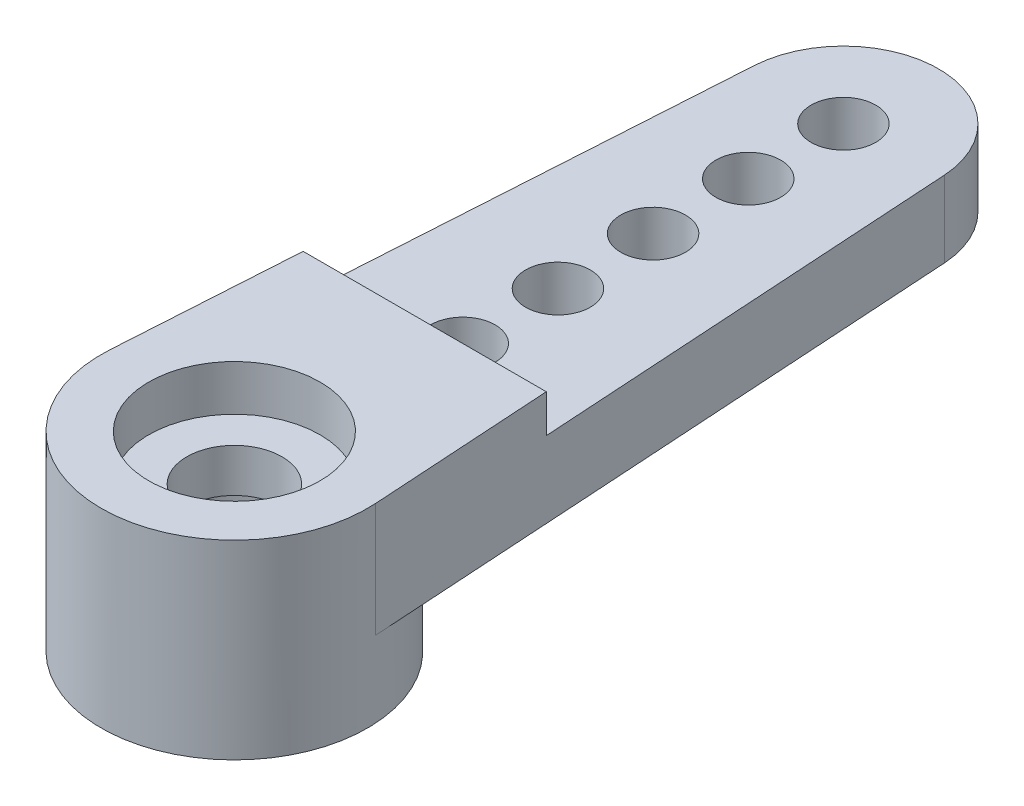
ISO-10303-21;
HEADER;
FILE_DESCRIPTION(('STEP AP214'),'2;1');
FILE_NAME('part.step','',(''),(''),'','','');
FILE_SCHEMA(('AUTOMOTIVE_DESIGN { 1 0 10303 214 1 1 1 1 }'));
ENDSEC;
DATA;
#1=APPLICATION_CONTEXT('core data for automotive mechanical design processes');
#2=APPLICATION_PROTOCOL_DEFINITION('international standard','automotive_design',2000,#1);
#3=PRODUCT_CONTEXT('',#1,'mechanical');
#4=PRODUCT('Part','Part','',(#3));
#5=PRODUCT_RELATED_PRODUCT_CATEGORY('part','',(#4));
#6=PRODUCT_DEFINITION_FORMATION('','',#4);
#7=PRODUCT_DEFINITION_CONTEXT('part definition',#1,'design');
#8=PRODUCT_DEFINITION('design','',#6,#7);
#9=PRODUCT_DEFINITION_SHAPE('','',#8);
#10=(LENGTH_UNIT() NAMED_UNIT(*) SI_UNIT(.MILLI.,.METRE.));
#11=(NAMED_UNIT(*) PLANE_ANGLE_UNIT() SI_UNIT($,.RADIAN.));
#12=(NAMED_UNIT(*) SI_UNIT($,.STERADIAN.) SOLID_ANGLE_UNIT());
#13=UNCERTAINTY_MEASURE_WITH_UNIT(LENGTH_MEASURE(1.E-05),#10,'distance_accuracy_value','');
#14=(GEOMETRIC_REPRESENTATION_CONTEXT(3) GLOBAL_UNCERTAINTY_ASSIGNED_CONTEXT((#13)) GLOBAL_UNIT_ASSIGNED_CONTEXT((#10,
#11,#12)) REPRESENTATION_CONTEXT('',''));
#15=CARTESIAN_POINT('',(0.,0.,0.));
#16=DIRECTION('',(0.,0.,1.));
#17=DIRECTION('',(1.,0.,0.));
#18=AXIS2_PLACEMENT_3D('',#15,#16,#17);
#19=CARTESIAN_POINT('',(0.,0.,0.));
#20=DIRECTION('',(0.,-1.,0.));
#21=DIRECTION('',(0.,0.,-1.));
#22=AXIS2_PLACEMENT_3D('',#19,#20,#21);
#23=CYLINDRICAL_SURFACE('',#22,3.5);
#24=CARTESIAN_POINT('',(0.,5.,0.));
#25=DIRECTION('',(0.,-1.,0.));
#26=DIRECTION('',(0.,0.,-1.));
#27=AXIS2_PLACEMENT_3D('',#24,#25,#26);
#28=CIRCLE('',#27,3.5);
#29=CARTESIAN_POINT('',(3.49315737370935,5.,-0.21875));
#30=VERTEX_POINT('',#29);
#31=CARTESIAN_POINT('',(-3.49315737370935,5.,-0.218749999999999));
#32=VERTEX_POINT('',#31);
#33=EDGE_CURVE('E119',#30,#32,#28,.T.);
#34=ORIENTED_EDGE('',*,*,#33,.T.);
#35=DIRECTION('',(0.,-1.,0.));
#36=VECTOR('',#35,1.);
#37=CARTESIAN_POINT('',(-3.49315737370935,4.,-0.218749999999998));
#38=LINE('',#37,#36);
#39=CARTESIAN_POINT('',(-3.49315737370935,2.,-0.218749999999998));
#40=VERTEX_POINT('',#39);
#41=EDGE_CURVE('E84',#32,#40,#38,.T.);
#42=ORIENTED_EDGE('',*,*,#41,.T.);
#43=CARTESIAN_POINT('',(0.,2.,0.));
#44=DIRECTION('',(0.,1.,0.));
#45=DIRECTION('',(0.,0.,-1.));
#46=AXIS2_PLACEMENT_3D('',#43,#44,#45);
#47=CIRCLE('',#46,3.5);
#48=CARTESIAN_POINT('',(3.49315737370935,2.,-0.21875));
#49=VERTEX_POINT('',#48);
#50=EDGE_CURVE('E93',#49,#40,#47,.T.);
#51=ORIENTED_EDGE('',*,*,#50,.F.);
#52=DIRECTION('',(0.,-1.,0.));
#53=VECTOR('',#52,1.);
#54=CARTESIAN_POINT('',(3.49315737370935,4.,-0.21875));
#55=LINE('',#54,#53);
#56=EDGE_CURVE('E102',#30,#49,#55,.T.);
#57=ORIENTED_EDGE('',*,*,#56,.F.);
#58=EDGE_LOOP('',(#34,#42,#51,#57));
#59=FACE_BOUND('',#58,.T.);
#60=CARTESIAN_POINT('',(0.,0.,0.));
#61=DIRECTION('',(0.,-1.,0.));
#62=DIRECTION('',(0.,0.,-1.));
#63=AXIS2_PLACEMENT_3D('',#60,#61,#62);
#64=CIRCLE('',#63,3.5);
#65=CARTESIAN_POINT('',(0.,0.,-3.5));
#66=VERTEX_POINT('',#65);
#67=EDGE_CURVE('E44',#66,#66,#64,.T.);
#68=ORIENTED_EDGE('',*,*,#67,.F.);
#69=EDGE_LOOP('',(#68));
#70=FACE_BOUND('',#69,.T.);
#71=ADVANCED_FACE('F36',(#59,#70),#23,.T.);
#72=CARTESIAN_POINT('',(0.,0.,0.));
#73=DIRECTION('',(0.,-1.,0.));
#74=DIRECTION('',(0.,0.,-1.));
#75=AXIS2_PLACEMENT_3D('',#72,#73,#74);
#76=CYLINDRICAL_SURFACE('',#75,2.4);
#77=CARTESIAN_POINT('',(0.,2.66,0.));
#78=DIRECTION('',(0.,-1.,0.));
#79=DIRECTION('',(0.,0.,-1.));
#80=AXIS2_PLACEMENT_3D('',#77,#78,#79);
#81=CIRCLE('',#80,2.4);
#82=CARTESIAN_POINT('',(0.,2.66,-2.4));
#83=VERTEX_POINT('',#82);
#84=EDGE_CURVE('E83',#83,#83,#81,.T.);
#85=ORIENTED_EDGE('',*,*,#84,.F.);
#86=EDGE_LOOP('',(#85));
#87=FACE_BOUND('',#86,.T.);
#88=CARTESIAN_POINT('',(0.,0.,0.));
#89=DIRECTION('',(0.,-1.,0.));
#90=DIRECTION('',(0.,0.,-1.));
#91=AXIS2_PLACEMENT_3D('',#88,#89,#90);
#92=CIRCLE('',#91,2.4);
#93=CARTESIAN_POINT('',(0.,0.,-2.4));
#94=VERTEX_POINT('',#93);
#95=EDGE_CURVE('E11',#94,#94,#92,.T.);
#96=ORIENTED_EDGE('',*,*,#95,.T.);
#97=EDGE_LOOP('',(#96));
#98=FACE_BOUND('',#97,.T.);
#99=ADVANCED_FACE('F38',(#87,#98),#76,.F.);
#100=CARTESIAN_POINT('',(-2.4,0.,0.));
#101=DIRECTION('',(0.,1.,0.));
#102=DIRECTION('',(0.,0.,1.));
#103=AXIS2_PLACEMENT_3D('',#100,#101,#102);
#104=PLANE('',#103);
#105=ORIENTED_EDGE('',*,*,#95,.F.);
#106=EDGE_LOOP('',(#105));
#107=FACE_BOUND('',#106,.T.);
#108=ORIENTED_EDGE('',*,*,#67,.T.);
#109=EDGE_LOOP('',(#108));
#110=FACE_BOUND('',#109,.T.);
#111=ADVANCED_FACE('F124',(#107,#110),#104,.F.);
#112=CARTESIAN_POINT('',(-3.5,5.,0.));
#113=DIRECTION('',(0.,-1.,0.));
#114=DIRECTION('',(0.,0.,-1.));
#115=AXIS2_PLACEMENT_3D('',#112,#113,#114);
#116=PLANE('',#115);
#117=ORIENTED_EDGE('',*,*,#33,.F.);
#118=DIRECTION('',(-0.0624999999999998,0.,-0.998044963916957));
#119=VECTOR('',#118,1.);
#120=CARTESIAN_POINT('',(3.19374388453426,5.,-5.));
#121=LINE('',#120,#119);
#122=CARTESIAN_POINT('',(3.19374388453426,5.,-5.));
#123=VERTEX_POINT('',#122);
#124=EDGE_CURVE('E228',#30,#123,#121,.T.);
#125=ORIENTED_EDGE('',*,*,#124,.T.);
#126=DIRECTION('',(-1.,0.,0.));
#127=VECTOR('',#126,1.);
#128=CARTESIAN_POINT('',(-3.19374388453426,5.,-5.));
#129=LINE('',#128,#127);
#130=CARTESIAN_POINT('',(-3.19374388453426,5.,-5.));
#131=VERTEX_POINT('',#130);
#132=EDGE_CURVE('E238',#123,#131,#129,.T.);
#133=ORIENTED_EDGE('',*,*,#132,.T.);
#134=DIRECTION('',(-0.0624999999999999,0.,0.998044963916957));
#135=VECTOR('',#134,1.);
#136=CARTESIAN_POINT('',(-3.49315737370935,5.,-0.218749999999998));
#137=LINE('',#136,#135);
#138=EDGE_CURVE('E225',#131,#32,#137,.T.);
#139=ORIENTED_EDGE('',*,*,#138,.T.);
#140=EDGE_LOOP('',(#117,#125,#133,#139));
#141=FACE_BOUND('',#140,.T.);
#142=CARTESIAN_POINT('',(0.,5.,0.));
#143=DIRECTION('',(0.,-1.,0.));
#144=DIRECTION('',(0.,0.,-1.));
#145=AXIS2_PLACEMENT_3D('',#142,#143,#144);
#146=CIRCLE('',#145,2.25);
#147=CARTESIAN_POINT('',(0.,5.,-2.25));
#148=VERTEX_POINT('',#147);
#149=EDGE_CURVE('E116',#148,#148,#146,.T.);
#150=ORIENTED_EDGE('',*,*,#149,.T.);
#151=EDGE_LOOP('',(#150));
#152=FACE_BOUND('',#151,.T.);
#153=ADVANCED_FACE('F134',(#141,#152),#116,.F.);
#154=CARTESIAN_POINT('',(0.,0.,0.));
#155=DIRECTION('',(0.,-1.,0.));
#156=DIRECTION('',(0.,0.,-1.));
#157=AXIS2_PLACEMENT_3D('',#154,#155,#156);
#158=CYLINDRICAL_SURFACE('',#157,2.25);
#159=ORIENTED_EDGE('',*,*,#149,.F.);
#160=EDGE_LOOP('',(#159));
#161=FACE_BOUND('',#160,.T.);
#162=CARTESIAN_POINT('',(0.,3.8,0.));
#163=DIRECTION('',(0.,-1.,0.));
#164=DIRECTION('',(0.,0.,-1.));
#165=AXIS2_PLACEMENT_3D('',#162,#163,#164);
#166=CIRCLE('',#165,2.25);
#167=CARTESIAN_POINT('',(0.,3.8,-2.25));
#168=VERTEX_POINT('',#167);
#169=EDGE_CURVE('E113',#168,#168,#166,.T.);
#170=ORIENTED_EDGE('',*,*,#169,.T.);
#171=EDGE_LOOP('',(#170));
#172=FACE_BOUND('',#171,.T.);
#173=ADVANCED_FACE('F141',(#161,#172),#158,.F.);
#174=CARTESIAN_POINT('',(-2.25,3.8,0.));
#175=DIRECTION('',(0.,-1.,0.));
#176=DIRECTION('',(0.,0.,-1.));
#177=AXIS2_PLACEMENT_3D('',#174,#175,#176);
#178=PLANE('',#177);
#179=ORIENTED_EDGE('',*,*,#169,.F.);
#180=EDGE_LOOP('',(#179));
#181=FACE_BOUND('',#180,.T.);
#182=CARTESIAN_POINT('',(0.,3.8,0.));
#183=DIRECTION('',(0.,-1.,0.));
#184=DIRECTION('',(0.,0.,-1.));
#185=AXIS2_PLACEMENT_3D('',#182,#183,#184);
#186=CIRCLE('',#185,1.25);
#187=CARTESIAN_POINT('',(0.,3.8,-1.25));
#188=VERTEX_POINT('',#187);
#189=EDGE_CURVE('E110',#188,#188,#186,.T.);
#190=ORIENTED_EDGE('',*,*,#189,.T.);
#191=EDGE_LOOP('',(#190));
#192=FACE_BOUND('',#191,.T.);
#193=ADVANCED_FACE('F148',(#181,#192),#178,.F.);
#194=CARTESIAN_POINT('',(0.,0.,0.));
#195=DIRECTION('',(0.,-1.,0.));
#196=DIRECTION('',(0.,0.,-1.));
#197=AXIS2_PLACEMENT_3D('',#194,#195,#196);
#198=CYLINDRICAL_SURFACE('',#197,1.25);
#199=ORIENTED_EDGE('',*,*,#189,.F.);
#200=EDGE_LOOP('',(#199));
#201=FACE_BOUND('',#200,.T.);
#202=CARTESIAN_POINT('',(0.,2.66,0.));
#203=DIRECTION('',(0.,-1.,0.));
#204=DIRECTION('',(0.,0.,-1.));
#205=AXIS2_PLACEMENT_3D('',#202,#203,#204);
#206=CIRCLE('',#205,1.25);
#207=CARTESIAN_POINT('',(0.,2.66,-1.25));
#208=VERTEX_POINT('',#207);
#209=EDGE_CURVE('E107',#208,#208,#206,.T.);
#210=ORIENTED_EDGE('',*,*,#209,.T.);
#211=EDGE_LOOP('',(#210));
#212=FACE_BOUND('',#211,.T.);
#213=ADVANCED_FACE('F161',(#201,#212),#198,.F.);
#214=CARTESIAN_POINT('',(-1.25,2.66,0.));
#215=DIRECTION('',(0.,1.,0.));
#216=DIRECTION('',(0.,0.,1.));
#217=AXIS2_PLACEMENT_3D('',#214,#215,#216);
#218=PLANE('',#217);
#219=ORIENTED_EDGE('',*,*,#209,.F.);
#220=EDGE_LOOP('',(#219));
#221=FACE_BOUND('',#220,.T.);
#222=ORIENTED_EDGE('',*,*,#84,.T.);
#223=EDGE_LOOP('',(#222));
#224=FACE_BOUND('',#223,.T.);
#225=ADVANCED_FACE('F167',(#221,#224),#218,.F.);
#226=CARTESIAN_POINT('',(0.,4.,-16.));
#227=DIRECTION('',(0.,-1.,0.));
#228=DIRECTION('',(0.,0.,-1.));
#229=AXIS2_PLACEMENT_3D('',#226,#227,#228);
#230=CYLINDRICAL_SURFACE('',#229,2.5);
#231=CARTESIAN_POINT('',(0.,2.,-16.));
#232=DIRECTION('',(0.,-1.,0.));
#233=DIRECTION('',(0.,0.,-1.));
#234=AXIS2_PLACEMENT_3D('',#231,#232,#233);
#235=CIRCLE('',#234,2.5);
#236=CARTESIAN_POINT('',(-2.49511240979239,2.,-16.15625));
#237=VERTEX_POINT('',#236);
#238=CARTESIAN_POINT('',(2.49511240979239,2.,-16.15625));
#239=VERTEX_POINT('',#238);
#240=EDGE_CURVE('E86',#237,#239,#235,.T.);
#241=ORIENTED_EDGE('',*,*,#240,.F.);
#242=DIRECTION('',(0.,-1.,0.));
#243=VECTOR('',#242,1.);
#244=CARTESIAN_POINT('',(-2.49511240979239,4.,-16.15625));
#245=LINE('',#244,#243);
#246=CARTESIAN_POINT('',(-2.49511240979239,4.,-16.15625));
#247=VERTEX_POINT('',#246);
#248=EDGE_CURVE('E73',#247,#237,#245,.T.);
#249=ORIENTED_EDGE('',*,*,#248,.F.);
#250=CARTESIAN_POINT('',(0.,4.,-16.));
#251=DIRECTION('',(0.,-1.,0.));
#252=DIRECTION('',(0.,0.,-1.));
#253=AXIS2_PLACEMENT_3D('',#250,#251,#252);
#254=CIRCLE('',#253,2.5);
#255=CARTESIAN_POINT('',(2.49511240979239,4.,-16.15625));
#256=VERTEX_POINT('',#255);
#257=EDGE_CURVE('E94',#247,#256,#254,.T.);
#258=ORIENTED_EDGE('',*,*,#257,.T.);
#259=DIRECTION('',(0.,-1.,0.));
#260=VECTOR('',#259,1.);
#261=CARTESIAN_POINT('',(2.49511240979239,4.,-16.15625));
#262=LINE('',#261,#260);
#263=EDGE_CURVE('E88',#256,#239,#262,.T.);
#264=ORIENTED_EDGE('',*,*,#263,.T.);
#265=EDGE_LOOP('',(#241,#249,#258,#264));
#266=FACE_BOUND('',#265,.T.);
#267=ADVANCED_FACE('F87',(#266),#230,.T.);
#268=CARTESIAN_POINT('',(-2.49511240979239,4.,-16.15625));
#269=DIRECTION('',(-0.998044963916957,0.,-0.0625));
#270=DIRECTION('',(-0.0625,0.,0.998044963916957));
#271=AXIS2_PLACEMENT_3D('',#268,#269,#270);
#272=PLANE('',#271);
#273=DIRECTION('',(0.0625,0.,-0.998044963916957));
#274=VECTOR('',#273,1.);
#275=CARTESIAN_POINT('',(-2.49511240979239,2.,-16.15625));
#276=LINE('',#275,#274);
#277=EDGE_CURVE('E78',#40,#237,#276,.T.);
#278=ORIENTED_EDGE('',*,*,#277,.F.);
#279=ORIENTED_EDGE('',*,*,#41,.F.);
#280=ORIENTED_EDGE('',*,*,#138,.F.);
#281=DIRECTION('',(0.,1.,0.));
#282=VECTOR('',#281,1.);
#283=CARTESIAN_POINT('',(-3.19374388453426,4.,-5.));
#284=LINE('',#283,#282);
#285=CARTESIAN_POINT('',(-3.19374388453426,4.,-5.));
#286=VERTEX_POINT('',#285);
#287=EDGE_CURVE('E89',#286,#131,#284,.T.);
#288=ORIENTED_EDGE('',*,*,#287,.F.);
#289=DIRECTION('',(0.0625,0.,-0.998044963916957));
#290=VECTOR('',#289,1.);
#291=CARTESIAN_POINT('',(-2.49511240979239,4.,-16.15625));
#292=LINE('',#291,#290);
#293=EDGE_CURVE('E60',#286,#247,#292,.T.);
#294=ORIENTED_EDGE('',*,*,#293,.T.);
#295=ORIENTED_EDGE('',*,*,#248,.T.);
#296=EDGE_LOOP('',(#278,#279,#280,#288,#294,#295));
#297=FACE_BOUND('',#296,.T.);
#298=ADVANCED_FACE('F75',(#297),#272,.T.);
#299=CARTESIAN_POINT('',(2.49511240979239,4.,-16.15625));
#300=DIRECTION('',(0.998044963916957,0.,-0.0624999999999999));
#301=DIRECTION('',(-0.0625,0.,-0.998044963916957));
#302=AXIS2_PLACEMENT_3D('',#299,#300,#301);
#303=PLANE('',#302);
#304=DIRECTION('',(0.0624999999999999,0.,0.998044963916957));
#305=VECTOR('',#304,1.);
#306=CARTESIAN_POINT('',(2.49511240979239,2.,-16.15625));
#307=LINE('',#306,#305);
#308=EDGE_CURVE('E51',#239,#49,#307,.T.);
#309=ORIENTED_EDGE('',*,*,#308,.F.);
#310=ORIENTED_EDGE('',*,*,#263,.F.);
#311=DIRECTION('',(0.0624999999999999,0.,0.998044963916957));
#312=VECTOR('',#311,1.);
#313=CARTESIAN_POINT('',(2.49511240979239,4.,-16.15625));
#314=LINE('',#313,#312);
#315=CARTESIAN_POINT('',(3.19374388453426,4.,-5.));
#316=VERTEX_POINT('',#315);
#317=EDGE_CURVE('E96',#256,#316,#314,.T.);
#318=ORIENTED_EDGE('',*,*,#317,.T.);
#319=DIRECTION('',(0.,1.,0.));
#320=VECTOR('',#319,1.);
#321=CARTESIAN_POINT('',(3.19374388453426,4.,-5.));
#322=LINE('',#321,#320);
#323=EDGE_CURVE('E237',#316,#123,#322,.T.);
#324=ORIENTED_EDGE('',*,*,#323,.T.);
#325=ORIENTED_EDGE('',*,*,#124,.F.);
#326=ORIENTED_EDGE('',*,*,#56,.T.);
#327=EDGE_LOOP('',(#309,#310,#318,#324,#325,#326));
#328=FACE_BOUND('',#327,.T.);
#329=ADVANCED_FACE('F180',(#328),#303,.T.);
#330=CARTESIAN_POINT('',(0.,4.,-16.));
#331=DIRECTION('',(0.,-1.,0.));
#332=DIRECTION('',(0.,0.,-1.));
#333=AXIS2_PLACEMENT_3D('',#330,#331,#332);
#334=PLANE('',#333);
#335=CARTESIAN_POINT('',(0.,4.,-6.));
#336=DIRECTION('',(0.,-1.,0.));
#337=DIRECTION('',(0.,0.,-1.));
#338=AXIS2_PLACEMENT_3D('',#335,#336,#337);
#339=CIRCLE('',#338,0.85);
#340=CARTESIAN_POINT('',(0.,4.,-6.85));
#341=VERTEX_POINT('',#340);
#342=EDGE_CURVE('E224',#341,#341,#339,.T.);
#343=ORIENTED_EDGE('',*,*,#342,.T.);
#344=EDGE_LOOP('',(#343));
#345=FACE_BOUND('',#344,.T.);
#346=CARTESIAN_POINT('',(0.,4.,-16.));
#347=DIRECTION('',(0.,-1.,0.));
#348=DIRECTION('',(0.,0.,-1.));
#349=AXIS2_PLACEMENT_3D('',#346,#347,#348);
#350=CIRCLE('',#349,0.85);
#351=CARTESIAN_POINT('',(0.,4.,-16.85));
#352=VERTEX_POINT('',#351);
#353=EDGE_CURVE('E226',#352,#352,#350,.T.);
#354=ORIENTED_EDGE('',*,*,#353,.T.);
#355=EDGE_LOOP('',(#354));
#356=FACE_BOUND('',#355,.T.);
#357=CARTESIAN_POINT('',(0.,4.,-13.5));
#358=DIRECTION('',(0.,-1.,0.));
#359=DIRECTION('',(0.,0.,-1.));
#360=AXIS2_PLACEMENT_3D('',#357,#358,#359);
#361=CIRCLE('',#360,0.85);
#362=CARTESIAN_POINT('',(0.,4.,-14.35));
#363=VERTEX_POINT('',#362);
#364=EDGE_CURVE('E231',#363,#363,#361,.T.);
#365=ORIENTED_EDGE('',*,*,#364,.T.);
#366=EDGE_LOOP('',(#365));
#367=FACE_BOUND('',#366,.T.);
#368=CARTESIAN_POINT('',(0.,4.,-8.5));
#369=DIRECTION('',(0.,-1.,0.));
#370=DIRECTION('',(0.,0.,-1.));
#371=AXIS2_PLACEMENT_3D('',#368,#369,#370);
#372=CIRCLE('',#371,0.85);
#373=CARTESIAN_POINT('',(0.,4.,-9.35));
#374=VERTEX_POINT('',#373);
#375=EDGE_CURVE('E268',#374,#374,#372,.T.);
#376=ORIENTED_EDGE('',*,*,#375,.T.);
#377=EDGE_LOOP('',(#376));
#378=FACE_BOUND('',#377,.T.);
#379=CARTESIAN_POINT('',(0.,4.,-11.));
#380=DIRECTION('',(0.,-1.,0.));
#381=DIRECTION('',(0.,0.,-1.));
#382=AXIS2_PLACEMENT_3D('',#379,#380,#381);
#383=CIRCLE('',#382,0.85);
#384=CARTESIAN_POINT('',(0.,4.,-11.85));
#385=VERTEX_POINT('',#384);
#386=EDGE_CURVE('E271',#385,#385,#383,.T.);
#387=ORIENTED_EDGE('',*,*,#386,.T.);
#388=EDGE_LOOP('',(#387));
#389=FACE_BOUND('',#388,.T.);
#390=ORIENTED_EDGE('',*,*,#293,.F.);
#391=DIRECTION('',(-1.,0.,0.));
#392=VECTOR('',#391,1.);
#393=CARTESIAN_POINT('',(-3.19374388453426,4.,-5.));
#394=LINE('',#393,#392);
#395=EDGE_CURVE('E235',#316,#286,#394,.T.);
#396=ORIENTED_EDGE('',*,*,#395,.F.);
#397=ORIENTED_EDGE('',*,*,#317,.F.);
#398=ORIENTED_EDGE('',*,*,#257,.F.);
#399=EDGE_LOOP('',(#390,#396,#397,#398));
#400=FACE_BOUND('',#399,.T.);
#401=ADVANCED_FACE('F183',(#345,#356,#367,#378,#389,#400),#334,.F.);
#402=CARTESIAN_POINT('',(0.,2.,-16.));
#403=DIRECTION('',(0.,-1.,0.));
#404=DIRECTION('',(0.,0.,-1.));
#405=AXIS2_PLACEMENT_3D('',#402,#403,#404);
#406=PLANE('',#405);
#407=CARTESIAN_POINT('',(0.,2.,-6.));
#408=DIRECTION('',(0.,-1.,0.));
#409=DIRECTION('',(0.,0.,-1.));
#410=AXIS2_PLACEMENT_3D('',#407,#408,#409);
#411=CIRCLE('',#410,0.85);
#412=CARTESIAN_POINT('',(0.,2.,-6.85));
#413=VERTEX_POINT('',#412);
#414=EDGE_CURVE('E221',#413,#413,#411,.T.);
#415=ORIENTED_EDGE('',*,*,#414,.F.);
#416=EDGE_LOOP('',(#415));
#417=FACE_BOUND('',#416,.T.);
#418=CARTESIAN_POINT('',(0.,2.,-16.));
#419=DIRECTION('',(0.,-1.,0.));
#420=DIRECTION('',(0.,0.,-1.));
#421=AXIS2_PLACEMENT_3D('',#418,#419,#420);
#422=CIRCLE('',#421,0.85);
#423=CARTESIAN_POINT('',(0.,2.,-16.85));
#424=VERTEX_POINT('',#423);
#425=EDGE_CURVE('E283',#424,#424,#422,.T.);
#426=ORIENTED_EDGE('',*,*,#425,.F.);
#427=EDGE_LOOP('',(#426));
#428=FACE_BOUND('',#427,.T.);
#429=CARTESIAN_POINT('',(0.,2.,-13.5));
#430=DIRECTION('',(0.,-1.,0.));
#431=DIRECTION('',(0.,0.,-1.));
#432=AXIS2_PLACEMENT_3D('',#429,#430,#431);
#433=CIRCLE('',#432,0.85);
#434=CARTESIAN_POINT('',(0.,2.,-14.35));
#435=VERTEX_POINT('',#434);
#436=EDGE_CURVE('E280',#435,#435,#433,.T.);
#437=ORIENTED_EDGE('',*,*,#436,.F.);
#438=EDGE_LOOP('',(#437));
#439=FACE_BOUND('',#438,.T.);
#440=CARTESIAN_POINT('',(0.,2.,-8.5));
#441=DIRECTION('',(0.,-1.,0.));
#442=DIRECTION('',(0.,0.,-1.));
#443=AXIS2_PLACEMENT_3D('',#440,#441,#442);
#444=CIRCLE('',#443,0.85);
#445=CARTESIAN_POINT('',(0.,2.,-9.35));
#446=VERTEX_POINT('',#445);
#447=EDGE_CURVE('E277',#446,#446,#444,.T.);
#448=ORIENTED_EDGE('',*,*,#447,.F.);
#449=EDGE_LOOP('',(#448));
#450=FACE_BOUND('',#449,.T.);
#451=CARTESIAN_POINT('',(0.,2.,-11.));
#452=DIRECTION('',(0.,-1.,0.));
#453=DIRECTION('',(0.,0.,-1.));
#454=AXIS2_PLACEMENT_3D('',#451,#452,#453);
#455=CIRCLE('',#454,0.85);
#456=CARTESIAN_POINT('',(0.,2.,-11.85));
#457=VERTEX_POINT('',#456);
#458=EDGE_CURVE('E274',#457,#457,#455,.T.);
#459=ORIENTED_EDGE('',*,*,#458,.F.);
#460=EDGE_LOOP('',(#459));
#461=FACE_BOUND('',#460,.T.);
#462=ORIENTED_EDGE('',*,*,#240,.T.);
#463=ORIENTED_EDGE('',*,*,#308,.T.);
#464=ORIENTED_EDGE('',*,*,#50,.T.);
#465=ORIENTED_EDGE('',*,*,#277,.T.);
#466=EDGE_LOOP('',(#462,#463,#464,#465));
#467=FACE_BOUND('',#466,.T.);
#468=ADVANCED_FACE('F91',(#417,#428,#439,#450,#461,#467),#406,.T.);
#469=CARTESIAN_POINT('',(-3.19374388453426,4.,-5.));
#470=DIRECTION('',(0.,0.,-1.));
#471=DIRECTION('',(-1.,0.,0.));
#472=AXIS2_PLACEMENT_3D('',#469,#470,#471);
#473=PLANE('',#472);
#474=ORIENTED_EDGE('',*,*,#132,.F.);
#475=ORIENTED_EDGE('',*,*,#323,.F.);
#476=ORIENTED_EDGE('',*,*,#395,.T.);
#477=ORIENTED_EDGE('',*,*,#287,.T.);
#478=EDGE_LOOP('',(#474,#475,#476,#477));
#479=FACE_BOUND('',#478,.T.);
#480=ADVANCED_FACE('F189',(#479),#473,.T.);
#481=CARTESIAN_POINT('',(0.,12.,-11.));
#482=DIRECTION('',(0.,-1.,0.));
#483=DIRECTION('',(0.,0.,-1.));
#484=AXIS2_PLACEMENT_3D('',#481,#482,#483);
#485=CYLINDRICAL_SURFACE('',#484,0.85);
#486=ORIENTED_EDGE('',*,*,#458,.T.);
#487=EDGE_LOOP('',(#486));
#488=FACE_BOUND('',#487,.T.);
#489=ORIENTED_EDGE('',*,*,#386,.F.);
#490=EDGE_LOOP('',(#489));
#491=FACE_BOUND('',#490,.T.);
#492=ADVANCED_FACE('F196',(#488,#491),#485,.F.);
#493=CARTESIAN_POINT('',(0.,12.,-8.5));
#494=DIRECTION('',(0.,-1.,0.));
#495=DIRECTION('',(0.,0.,-1.));
#496=AXIS2_PLACEMENT_3D('',#493,#494,#495);
#497=CYLINDRICAL_SURFACE('',#496,0.85);
#498=ORIENTED_EDGE('',*,*,#447,.T.);
#499=EDGE_LOOP('',(#498));
#500=FACE_BOUND('',#499,.T.);
#501=ORIENTED_EDGE('',*,*,#375,.F.);
#502=EDGE_LOOP('',(#501));
#503=FACE_BOUND('',#502,.T.);
#504=ADVANCED_FACE('F200',(#500,#503),#497,.F.);
#505=CARTESIAN_POINT('',(0.,12.,-13.5));
#506=DIRECTION('',(0.,-1.,0.));
#507=DIRECTION('',(0.,0.,-1.));
#508=AXIS2_PLACEMENT_3D('',#505,#506,#507);
#509=CYLINDRICAL_SURFACE('',#508,0.85);
#510=ORIENTED_EDGE('',*,*,#436,.T.);
#511=EDGE_LOOP('',(#510));
#512=FACE_BOUND('',#511,.T.);
#513=ORIENTED_EDGE('',*,*,#364,.F.);
#514=EDGE_LOOP('',(#513));
#515=FACE_BOUND('',#514,.T.);
#516=ADVANCED_FACE('F204',(#512,#515),#509,.F.);
#517=CARTESIAN_POINT('',(0.,12.,-16.));
#518=DIRECTION('',(0.,-1.,0.));
#519=DIRECTION('',(0.,0.,-1.));
#520=AXIS2_PLACEMENT_3D('',#517,#518,#519);
#521=CYLINDRICAL_SURFACE('',#520,0.85);
#522=ORIENTED_EDGE('',*,*,#425,.T.);
#523=EDGE_LOOP('',(#522));
#524=FACE_BOUND('',#523,.T.);
#525=ORIENTED_EDGE('',*,*,#353,.F.);
#526=EDGE_LOOP('',(#525));
#527=FACE_BOUND('',#526,.T.);
#528=ADVANCED_FACE('F208',(#524,#527),#521,.F.);
#529=CARTESIAN_POINT('',(0.,12.,-6.));
#530=DIRECTION('',(0.,-1.,0.));
#531=DIRECTION('',(0.,0.,-1.));
#532=AXIS2_PLACEMENT_3D('',#529,#530,#531);
#533=CYLINDRICAL_SURFACE('',#532,0.85);
#534=ORIENTED_EDGE('',*,*,#414,.T.);
#535=EDGE_LOOP('',(#534));
#536=FACE_BOUND('',#535,.T.);
#537=ORIENTED_EDGE('',*,*,#342,.F.);
#538=EDGE_LOOP('',(#537));
#539=FACE_BOUND('',#538,.T.);
#540=ADVANCED_FACE('F212',(#536,#539),#533,.F.);
#541=CLOSED_SHELL('',(#71,#99,#111,#153,#173,#193,#213,#225,#267,#298,#329,#401,#468,#480,#492,
#504,#516,#528,#540));
#542=MANIFOLD_SOLID_BREP('B2',#541);
#543=ADVANCED_BREP_SHAPE_REPRESENTATION('',(#18,#542),#14);
#544=SHAPE_DEFINITION_REPRESENTATION(#9,#543);
ENDSEC;
END-ISO-10303-21;
